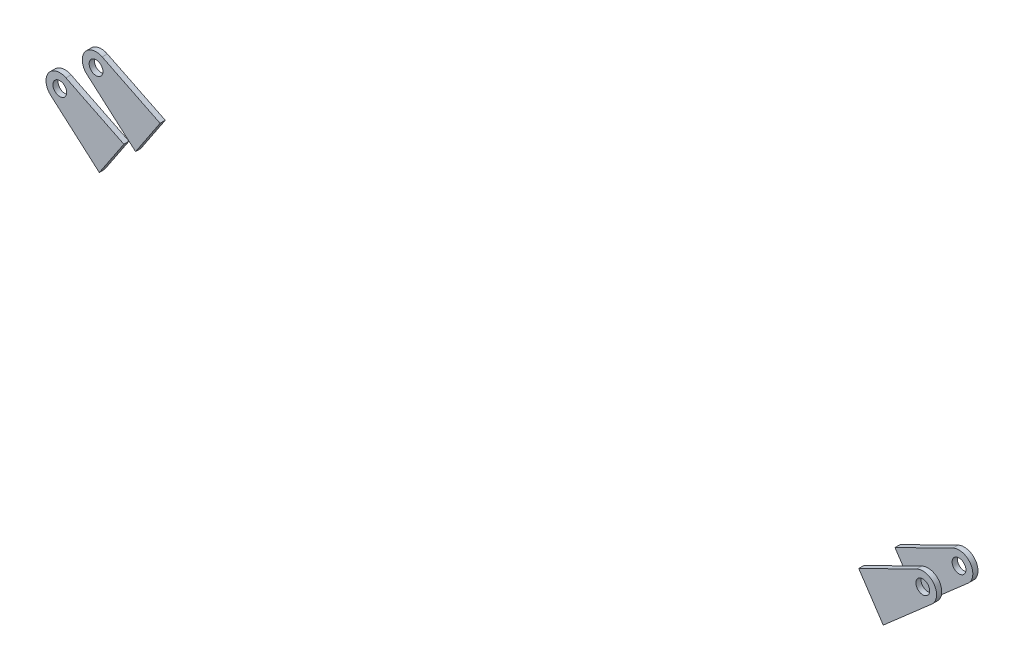
ISO-10303-21;
HEADER;
FILE_DESCRIPTION(('STEP AP214'),'2;1');
FILE_NAME('part.step','',(''),(''),'','','');
FILE_SCHEMA(('AUTOMOTIVE_DESIGN { 1 0 10303 214 1 1 1 1 }'));
ENDSEC;
DATA;
#1=APPLICATION_CONTEXT('core data for automotive mechanical design processes');
#2=APPLICATION_PROTOCOL_DEFINITION('international standard','automotive_design',2000,#1);
#3=PRODUCT_CONTEXT('',#1,'mechanical');
#4=PRODUCT('Part','Part','',(#3));
#5=PRODUCT_RELATED_PRODUCT_CATEGORY('part','',(#4));
#6=PRODUCT_DEFINITION_FORMATION('','',#4);
#7=PRODUCT_DEFINITION_CONTEXT('part definition',#1,'design');
#8=PRODUCT_DEFINITION('design','',#6,#7);
#9=PRODUCT_DEFINITION_SHAPE('','',#8);
#10=(LENGTH_UNIT() NAMED_UNIT(*) SI_UNIT(.MILLI.,.METRE.));
#11=(NAMED_UNIT(*) PLANE_ANGLE_UNIT() SI_UNIT($,.RADIAN.));
#12=(NAMED_UNIT(*) SI_UNIT($,.STERADIAN.) SOLID_ANGLE_UNIT());
#13=UNCERTAINTY_MEASURE_WITH_UNIT(LENGTH_MEASURE(1.E-05),#10,'distance_accuracy_value','');
#14=(GEOMETRIC_REPRESENTATION_CONTEXT(3) GLOBAL_UNCERTAINTY_ASSIGNED_CONTEXT((#13)) GLOBAL_UNIT_ASSIGNED_CONTEXT((#10,
#11,#12)) REPRESENTATION_CONTEXT('',''));
#15=CARTESIAN_POINT('',(0.,0.,0.));
#16=DIRECTION('',(0.,0.,1.));
#17=DIRECTION('',(1.,0.,0.));
#18=AXIS2_PLACEMENT_3D('',#15,#16,#17);
#19=CARTESIAN_POINT('',(2.08576992550041E-13,1.39051328366695E-13,120.));
#20=DIRECTION('',(0.,0.,1.));
#21=DIRECTION('',(1.,0.,0.));
#22=AXIS2_PLACEMENT_3D('',#19,#20,#21);
#23=PLANE('',#22);
#24=CARTESIAN_POINT('',(-250.,-2230.,119.999999999998));
#25=DIRECTION('',(0.,0.,-1.));
#26=DIRECTION('',(-1.,0.,0.));
#27=AXIS2_PLACEMENT_3D('',#24,#25,#26);
#28=CIRCLE('',#27,3.99999999999999);
#29=CARTESIAN_POINT('',(-254.,-2230.,119.999999999998));
#30=VERTEX_POINT('',#29);
#31=EDGE_CURVE('E145',#30,#30,#28,.T.);
#32=ORIENTED_EDGE('',*,*,#31,.F.);
#33=EDGE_LOOP('',(#32));
#34=FACE_BOUND('',#33,.T.);
#35=DIRECTION('',(0.55470019622526,0.832050294337823,0.));
#36=VECTOR('',#35,1.);
#37=CARTESIAN_POINT('',(-227.105319025276,-2260.65797853791,119.999999999998));
#38=LINE('',#37,#36);
#39=CARTESIAN_POINT('',(-227.105319025276,-2260.65797853791,119.999999999998));
#40=VERTEX_POINT('',#39);
#41=CARTESIAN_POINT('',(-212.894680974729,-2239.34202146209,119.999999999998));
#42=VERTEX_POINT('',#41);
#43=EDGE_CURVE('E131',#40,#42,#38,.T.);
#44=ORIENTED_EDGE('',*,*,#43,.F.);
#45=DIRECTION('',(0.752643086213187,-0.658428724142172,0.));
#46=VECTOR('',#45,1.);
#47=CARTESIAN_POINT('',(-255.267429793138,-2236.02114468971,119.999999999998));
#48=LINE('',#47,#46);
#49=CARTESIAN_POINT('',(-255.267429793138,-2236.02114468971,119.999999999998));
#50=VERTEX_POINT('',#49);
#51=EDGE_CURVE('E138',#50,#40,#48,.T.);
#52=ORIENTED_EDGE('',*,*,#51,.F.);
#53=CARTESIAN_POINT('',(-250.,-2230.,119.999999999998));
#54=DIRECTION('',(0.,0.,1.));
#55=DIRECTION('',(-1.,0.,0.));
#56=AXIS2_PLACEMENT_3D('',#53,#54,#55);
#57=CIRCLE('',#56,8.00000000000023);
#58=CARTESIAN_POINT('',(-246.467954822247,-2222.82193223337,119.999999999998));
#59=VERTEX_POINT('',#58);
#60=EDGE_CURVE('E160',#59,#50,#57,.T.);
#61=ORIENTED_EDGE('',*,*,#60,.F.);
#62=DIRECTION('',(-0.897258470828577,0.441505647219108,0.));
#63=VECTOR('',#62,1.);
#64=CARTESIAN_POINT('',(-212.894680974729,-2239.34202146209,119.999999999998));
#65=LINE('',#64,#63);
#66=EDGE_CURVE('E95',#42,#59,#65,.T.);
#67=ORIENTED_EDGE('',*,*,#66,.F.);
#68=EDGE_LOOP('',(#44,#52,#61,#67));
#69=FACE_BOUND('',#68,.T.);
#70=ADVANCED_FACE('F86',(#34,#69),#23,.F.);
#71=CARTESIAN_POINT('',(2.08576992550041E-13,1.39051328366695E-13,123.));
#72=DIRECTION('',(0.,0.,1.));
#73=DIRECTION('',(1.,0.,0.));
#74=AXIS2_PLACEMENT_3D('',#71,#72,#73);
#75=PLANE('',#74);
#76=CARTESIAN_POINT('',(-250.,-2230.,122.999999999998));
#77=DIRECTION('',(0.,0.,-1.));
#78=DIRECTION('',(-1.,0.,0.));
#79=AXIS2_PLACEMENT_3D('',#76,#77,#78);
#80=CIRCLE('',#79,3.99999999999999);
#81=CARTESIAN_POINT('',(-254.,-2230.,122.999999999998));
#82=VERTEX_POINT('',#81);
#83=EDGE_CURVE('E148',#82,#82,#80,.T.);
#84=ORIENTED_EDGE('',*,*,#83,.T.);
#85=EDGE_LOOP('',(#84));
#86=FACE_BOUND('',#85,.T.);
#87=DIRECTION('',(0.55470019622526,0.832050294337823,0.));
#88=VECTOR('',#87,1.);
#89=CARTESIAN_POINT('',(-227.105319025276,-2260.65797853791,122.999999999998));
#90=LINE('',#89,#88);
#91=CARTESIAN_POINT('',(-227.105319025276,-2260.65797853791,122.999999999998));
#92=VERTEX_POINT('',#91);
#93=CARTESIAN_POINT('',(-212.894680974729,-2239.34202146209,122.999999999998));
#94=VERTEX_POINT('',#93);
#95=EDGE_CURVE('E133',#92,#94,#90,.T.);
#96=ORIENTED_EDGE('',*,*,#95,.T.);
#97=DIRECTION('',(-0.897258470828577,0.441505647219108,0.));
#98=VECTOR('',#97,1.);
#99=CARTESIAN_POINT('',(-212.894680974729,-2239.34202146209,122.999999999998));
#100=LINE('',#99,#98);
#101=CARTESIAN_POINT('',(-246.467954822247,-2222.82193223337,122.999999999998));
#102=VERTEX_POINT('',#101);
#103=EDGE_CURVE('E13',#94,#102,#100,.T.);
#104=ORIENTED_EDGE('',*,*,#103,.T.);
#105=CARTESIAN_POINT('',(-250.,-2230.,122.999999999998));
#106=DIRECTION('',(0.,0.,1.));
#107=DIRECTION('',(-1.,0.,0.));
#108=AXIS2_PLACEMENT_3D('',#105,#106,#107);
#109=CIRCLE('',#108,8.00000000000023);
#110=CARTESIAN_POINT('',(-255.267429793138,-2236.02114468971,122.999999999998));
#111=VERTEX_POINT('',#110);
#112=EDGE_CURVE('E157',#102,#111,#109,.T.);
#113=ORIENTED_EDGE('',*,*,#112,.T.);
#114=DIRECTION('',(0.752643086213187,-0.658428724142172,0.));
#115=VECTOR('',#114,1.);
#116=CARTESIAN_POINT('',(-255.267429793138,-2236.02114468971,122.999999999998));
#117=LINE('',#116,#115);
#118=EDGE_CURVE('E162',#111,#92,#117,.T.);
#119=ORIENTED_EDGE('',*,*,#118,.T.);
#120=EDGE_LOOP('',(#96,#104,#113,#119));
#121=FACE_BOUND('',#120,.T.);
#122=ADVANCED_FACE('F174',(#86,#121),#75,.T.);
#123=CARTESIAN_POINT('',(-227.105319025276,-2260.65797853791,122.999999999998));
#124=DIRECTION('',(-0.832050294337823,0.55470019622526,0.));
#125=DIRECTION('',(0.55470019622526,0.832050294337824,0.));
#126=AXIS2_PLACEMENT_3D('',#123,#124,#125);
#127=PLANE('',#126);
#128=ORIENTED_EDGE('',*,*,#43,.T.);
#129=DIRECTION('',(0.,0.,-1.));
#130=VECTOR('',#129,1.);
#131=CARTESIAN_POINT('',(-212.894680974729,-2239.34202146209,122.999999999998));
#132=LINE('',#131,#130);
#133=EDGE_CURVE('E121',#94,#42,#132,.T.);
#134=ORIENTED_EDGE('',*,*,#133,.F.);
#135=ORIENTED_EDGE('',*,*,#95,.F.);
#136=DIRECTION('',(0.,0.,-1.));
#137=VECTOR('',#136,1.);
#138=CARTESIAN_POINT('',(-227.105319025276,-2260.65797853791,122.999999999998));
#139=LINE('',#138,#137);
#140=EDGE_CURVE('E127',#92,#40,#139,.T.);
#141=ORIENTED_EDGE('',*,*,#140,.T.);
#142=EDGE_LOOP('',(#128,#134,#135,#141));
#143=FACE_BOUND('',#142,.T.);
#144=ADVANCED_FACE('F129',(#143),#127,.F.);
#145=CARTESIAN_POINT('',(-255.267429793138,-2236.02114468971,122.999999999998));
#146=DIRECTION('',(0.658428724142172,0.752643086213187,0.));
#147=DIRECTION('',(0.752643086213187,-0.658428724142172,0.));
#148=AXIS2_PLACEMENT_3D('',#145,#146,#147);
#149=PLANE('',#148);
#150=ORIENTED_EDGE('',*,*,#51,.T.);
#151=ORIENTED_EDGE('',*,*,#140,.F.);
#152=ORIENTED_EDGE('',*,*,#118,.F.);
#153=DIRECTION('',(0.,0.,-1.));
#154=VECTOR('',#153,1.);
#155=CARTESIAN_POINT('',(-255.267429793138,-2236.02114468971,122.999999999998));
#156=LINE('',#155,#154);
#157=EDGE_CURVE('E140',#111,#50,#156,.T.);
#158=ORIENTED_EDGE('',*,*,#157,.T.);
#159=EDGE_LOOP('',(#150,#151,#152,#158));
#160=FACE_BOUND('',#159,.T.);
#161=ADVANCED_FACE('F139',(#160),#149,.F.);
#162=CARTESIAN_POINT('',(-250.,-2230.,122.999999999998));
#163=DIRECTION('',(0.,0.,-1.));
#164=DIRECTION('',(-1.,0.,0.));
#165=AXIS2_PLACEMENT_3D('',#162,#163,#164);
#166=CYLINDRICAL_SURFACE('',#165,8.00000000000023);
#167=ORIENTED_EDGE('',*,*,#60,.T.);
#168=ORIENTED_EDGE('',*,*,#157,.F.);
#169=ORIENTED_EDGE('',*,*,#112,.F.);
#170=DIRECTION('',(0.,0.,-1.));
#171=VECTOR('',#170,1.);
#172=CARTESIAN_POINT('',(-246.467954822247,-2222.82193223337,122.999999999998));
#173=LINE('',#172,#171);
#174=EDGE_CURVE('E104',#102,#59,#173,.T.);
#175=ORIENTED_EDGE('',*,*,#174,.T.);
#176=EDGE_LOOP('',(#167,#168,#169,#175));
#177=FACE_BOUND('',#176,.T.);
#178=ADVANCED_FACE('F210',(#177),#166,.T.);
#179=CARTESIAN_POINT('',(-212.894680974729,-2239.34202146209,122.999999999998));
#180=DIRECTION('',(-0.441505647219108,-0.897258470828577,0.));
#181=DIRECTION('',(-0.897258470828577,0.441505647219108,0.));
#182=AXIS2_PLACEMENT_3D('',#179,#180,#181);
#183=PLANE('',#182);
#184=ORIENTED_EDGE('',*,*,#66,.T.);
#185=ORIENTED_EDGE('',*,*,#174,.F.);
#186=ORIENTED_EDGE('',*,*,#103,.F.);
#187=ORIENTED_EDGE('',*,*,#133,.T.);
#188=EDGE_LOOP('',(#184,#185,#186,#187));
#189=FACE_BOUND('',#188,.T.);
#190=ADVANCED_FACE('F195',(#189),#183,.F.);
#191=CARTESIAN_POINT('',(-250.,-2230.,122.999999999998));
#192=DIRECTION('',(0.,0.,-1.));
#193=DIRECTION('',(-1.,0.,0.));
#194=AXIS2_PLACEMENT_3D('',#191,#192,#193);
#195=CYLINDRICAL_SURFACE('',#194,3.99999999999999);
#196=ORIENTED_EDGE('',*,*,#83,.F.);
#197=EDGE_LOOP('',(#196));
#198=FACE_BOUND('',#197,.T.);
#199=ORIENTED_EDGE('',*,*,#31,.T.);
#200=EDGE_LOOP('',(#199));
#201=FACE_BOUND('',#200,.T.);
#202=ADVANCED_FACE('F192',(#198,#201),#195,.F.);
#203=CLOSED_SHELL('',(#70,#122,#144,#161,#178,#190,#202));
#204=MANIFOLD_SOLID_BREP('B2',#203);
#205=CARTESIAN_POINT('',(2.08576992550041E-13,1.39051328366695E-13,143.999999999996));
#206=DIRECTION('',(0.,0.,-1.));
#207=DIRECTION('',(1.,0.,0.));
#208=AXIS2_PLACEMENT_3D('',#205,#206,#207);
#209=PLANE('',#208);
#210=CARTESIAN_POINT('',(-250.,-2230.,143.999999999998));
#211=DIRECTION('',(0.,0.,-1.));
#212=DIRECTION('',(-1.,0.,0.));
#213=AXIS2_PLACEMENT_3D('',#210,#211,#212);
#214=CIRCLE('',#213,3.99999999999999);
#215=CARTESIAN_POINT('',(-254.,-2230.,143.999999999998));
#216=VERTEX_POINT('',#215);
#217=EDGE_CURVE('E325',#216,#216,#214,.T.);
#218=ORIENTED_EDGE('',*,*,#217,.T.);
#219=EDGE_LOOP('',(#218));
#220=FACE_BOUND('',#219,.T.);
#221=DIRECTION('',(0.55470019622526,0.832050294337823,0.));
#222=VECTOR('',#221,1.);
#223=CARTESIAN_POINT('',(-227.105319025276,-2260.65797853791,143.999999999998));
#224=LINE('',#223,#222);
#225=CARTESIAN_POINT('',(-227.105319025276,-2260.65797853791,143.999999999998));
#226=VERTEX_POINT('',#225);
#227=CARTESIAN_POINT('',(-212.894680974729,-2239.34202146209,143.999999999998));
#228=VERTEX_POINT('',#227);
#229=EDGE_CURVE('E317',#226,#228,#224,.T.);
#230=ORIENTED_EDGE('',*,*,#229,.T.);
#231=DIRECTION('',(-0.897258470828577,0.441505647219108,0.));
#232=VECTOR('',#231,1.);
#233=CARTESIAN_POINT('',(-212.894680974729,-2239.34202146209,143.999999999998));
#234=LINE('',#233,#232);
#235=CARTESIAN_POINT('',(-246.467954822247,-2222.82193223337,143.999999999998));
#236=VERTEX_POINT('',#235);
#237=EDGE_CURVE('E274',#228,#236,#234,.T.);
#238=ORIENTED_EDGE('',*,*,#237,.T.);
#239=CARTESIAN_POINT('',(-250.,-2230.,143.999999999998));
#240=DIRECTION('',(0.,0.,1.));
#241=DIRECTION('',(-1.,0.,0.));
#242=AXIS2_PLACEMENT_3D('',#239,#240,#241);
#243=CIRCLE('',#242,8.00000000000023);
#244=CARTESIAN_POINT('',(-255.267429793138,-2236.02114468971,143.999999999998));
#245=VERTEX_POINT('',#244);
#246=EDGE_CURVE('E321',#236,#245,#243,.T.);
#247=ORIENTED_EDGE('',*,*,#246,.T.);
#248=DIRECTION('',(0.752643086213187,-0.658428724142172,0.));
#249=VECTOR('',#248,1.);
#250=CARTESIAN_POINT('',(-255.267429793138,-2236.02114468971,143.999999999998));
#251=LINE('',#250,#249);
#252=EDGE_CURVE('E311',#245,#226,#251,.T.);
#253=ORIENTED_EDGE('',*,*,#252,.T.);
#254=EDGE_LOOP('',(#230,#238,#247,#253));
#255=FACE_BOUND('',#254,.T.);
#256=ADVANCED_FACE('F265',(#220,#255),#209,.F.);
#257=CARTESIAN_POINT('',(2.08576992550041E-13,1.39051328366695E-13,140.999999999996));
#258=DIRECTION('',(0.,0.,-1.));
#259=DIRECTION('',(1.,0.,0.));
#260=AXIS2_PLACEMENT_3D('',#257,#258,#259);
#261=PLANE('',#260);
#262=CARTESIAN_POINT('',(-250.,-2230.,140.999999999998));
#263=DIRECTION('',(0.,0.,-1.));
#264=DIRECTION('',(-1.,0.,0.));
#265=AXIS2_PLACEMENT_3D('',#262,#263,#264);
#266=CIRCLE('',#265,3.99999999999999);
#267=CARTESIAN_POINT('',(-254.,-2230.,140.999999999998));
#268=VERTEX_POINT('',#267);
#269=EDGE_CURVE('E328',#268,#268,#266,.T.);
#270=ORIENTED_EDGE('',*,*,#269,.F.);
#271=EDGE_LOOP('',(#270));
#272=FACE_BOUND('',#271,.T.);
#273=DIRECTION('',(0.55470019622526,0.832050294337823,0.));
#274=VECTOR('',#273,1.);
#275=CARTESIAN_POINT('',(-227.105319025276,-2260.65797853791,140.999999999998));
#276=LINE('',#275,#274);
#277=CARTESIAN_POINT('',(-227.105319025276,-2260.65797853791,140.999999999998));
#278=VERTEX_POINT('',#277);
#279=CARTESIAN_POINT('',(-212.894680974729,-2239.34202146209,140.999999999998));
#280=VERTEX_POINT('',#279);
#281=EDGE_CURVE('E316',#278,#280,#276,.T.);
#282=ORIENTED_EDGE('',*,*,#281,.F.);
#283=DIRECTION('',(0.752643086213187,-0.658428724142172,0.));
#284=VECTOR('',#283,1.);
#285=CARTESIAN_POINT('',(-255.267429793138,-2236.02114468971,140.999999999998));
#286=LINE('',#285,#284);
#287=CARTESIAN_POINT('',(-255.267429793138,-2236.02114468971,140.999999999998));
#288=VERTEX_POINT('',#287);
#289=EDGE_CURVE('E314',#288,#278,#286,.T.);
#290=ORIENTED_EDGE('',*,*,#289,.F.);
#291=CARTESIAN_POINT('',(-250.,-2230.,140.999999999998));
#292=DIRECTION('',(0.,0.,1.));
#293=DIRECTION('',(-1.,0.,0.));
#294=AXIS2_PLACEMENT_3D('',#291,#292,#293);
#295=CIRCLE('',#294,8.00000000000023);
#296=CARTESIAN_POINT('',(-246.467954822247,-2222.82193223337,140.999999999998));
#297=VERTEX_POINT('',#296);
#298=EDGE_CURVE('E337',#297,#288,#295,.T.);
#299=ORIENTED_EDGE('',*,*,#298,.F.);
#300=DIRECTION('',(-0.897258470828577,0.441505647219108,0.));
#301=VECTOR('',#300,1.);
#302=CARTESIAN_POINT('',(-212.894680974729,-2239.34202146209,140.999999999998));
#303=LINE('',#302,#301);
#304=EDGE_CURVE('E84',#280,#297,#303,.T.);
#305=ORIENTED_EDGE('',*,*,#304,.F.);
#306=EDGE_LOOP('',(#282,#290,#299,#305));
#307=FACE_BOUND('',#306,.T.);
#308=ADVANCED_FACE('F354',(#272,#307),#261,.T.);
#309=CARTESIAN_POINT('',(-227.105319025276,-2260.65797853791,140.999999999998));
#310=DIRECTION('',(-0.832050294337823,0.55470019622526,0.));
#311=DIRECTION('',(0.55470019622526,0.832050294337824,0.));
#312=AXIS2_PLACEMENT_3D('',#309,#310,#311);
#313=PLANE('',#312);
#314=ORIENTED_EDGE('',*,*,#229,.F.);
#315=DIRECTION('',(0.,0.,1.));
#316=VECTOR('',#315,1.);
#317=CARTESIAN_POINT('',(-227.105319025276,-2260.65797853791,140.999999999998));
#318=LINE('',#317,#316);
#319=EDGE_CURVE('E308',#278,#226,#318,.T.);
#320=ORIENTED_EDGE('',*,*,#319,.F.);
#321=ORIENTED_EDGE('',*,*,#281,.T.);
#322=DIRECTION('',(0.,0.,1.));
#323=VECTOR('',#322,1.);
#324=CARTESIAN_POINT('',(-212.894680974729,-2239.34202146209,140.999999999998));
#325=LINE('',#324,#323);
#326=EDGE_CURVE('E302',#280,#228,#325,.T.);
#327=ORIENTED_EDGE('',*,*,#326,.T.);
#328=EDGE_LOOP('',(#314,#320,#321,#327));
#329=FACE_BOUND('',#328,.T.);
#330=ADVANCED_FACE('F324',(#329),#313,.F.);
#331=CARTESIAN_POINT('',(-255.267429793138,-2236.02114468971,140.999999999998));
#332=DIRECTION('',(0.658428724142172,0.752643086213187,0.));
#333=DIRECTION('',(0.752643086213187,-0.658428724142172,0.));
#334=AXIS2_PLACEMENT_3D('',#331,#332,#333);
#335=PLANE('',#334);
#336=ORIENTED_EDGE('',*,*,#252,.F.);
#337=DIRECTION('',(0.,0.,1.));
#338=VECTOR('',#337,1.);
#339=CARTESIAN_POINT('',(-255.267429793138,-2236.02114468971,140.999999999998));
#340=LINE('',#339,#338);
#341=EDGE_CURVE('E322',#288,#245,#340,.T.);
#342=ORIENTED_EDGE('',*,*,#341,.F.);
#343=ORIENTED_EDGE('',*,*,#289,.T.);
#344=ORIENTED_EDGE('',*,*,#319,.T.);
#345=EDGE_LOOP('',(#336,#342,#343,#344));
#346=FACE_BOUND('',#345,.T.);
#347=ADVANCED_FACE('F310',(#346),#335,.F.);
#348=CARTESIAN_POINT('',(-250.,-2230.,140.999999999998));
#349=DIRECTION('',(0.,0.,1.));
#350=DIRECTION('',(-1.,0.,0.));
#351=AXIS2_PLACEMENT_3D('',#348,#349,#350);
#352=CYLINDRICAL_SURFACE('',#351,8.00000000000023);
#353=ORIENTED_EDGE('',*,*,#246,.F.);
#354=DIRECTION('',(0.,0.,1.));
#355=VECTOR('',#354,1.);
#356=CARTESIAN_POINT('',(-246.467954822247,-2222.82193223337,140.999999999998));
#357=LINE('',#356,#355);
#358=EDGE_CURVE('E283',#297,#236,#357,.T.);
#359=ORIENTED_EDGE('',*,*,#358,.F.);
#360=ORIENTED_EDGE('',*,*,#298,.T.);
#361=ORIENTED_EDGE('',*,*,#341,.T.);
#362=EDGE_LOOP('',(#353,#359,#360,#361));
#363=FACE_BOUND('',#362,.T.);
#364=ADVANCED_FACE('F350',(#363),#352,.T.);
#365=CARTESIAN_POINT('',(-212.894680974729,-2239.34202146209,140.999999999998));
#366=DIRECTION('',(-0.441505647219108,-0.897258470828577,0.));
#367=DIRECTION('',(-0.897258470828577,0.441505647219108,0.));
#368=AXIS2_PLACEMENT_3D('',#365,#366,#367);
#369=PLANE('',#368);
#370=ORIENTED_EDGE('',*,*,#237,.F.);
#371=ORIENTED_EDGE('',*,*,#326,.F.);
#372=ORIENTED_EDGE('',*,*,#304,.T.);
#373=ORIENTED_EDGE('',*,*,#358,.T.);
#374=EDGE_LOOP('',(#370,#371,#372,#373));
#375=FACE_BOUND('',#374,.T.);
#376=ADVANCED_FACE('F367',(#375),#369,.F.);
#377=CARTESIAN_POINT('',(-250.,-2230.,140.999999999998));
#378=DIRECTION('',(0.,0.,1.));
#379=DIRECTION('',(-1.,0.,0.));
#380=AXIS2_PLACEMENT_3D('',#377,#378,#379);
#381=CYLINDRICAL_SURFACE('',#380,3.99999999999999);
#382=ORIENTED_EDGE('',*,*,#269,.T.);
#383=EDGE_LOOP('',(#382));
#384=FACE_BOUND('',#383,.T.);
#385=ORIENTED_EDGE('',*,*,#217,.F.);
#386=EDGE_LOOP('',(#385));
#387=FACE_BOUND('',#386,.T.);
#388=ADVANCED_FACE('F369',(#384,#387),#381,.F.);
#389=CLOSED_SHELL('',(#256,#308,#330,#347,#364,#376,#388));
#390=MANIFOLD_SOLID_BREP('B7',#389);
#391=CARTESIAN_POINT('',(-2.08576992550041E-13,1.39051328366695E-13,120.));
#392=DIRECTION('',(0.,0.,1.));
#393=DIRECTION('',(-1.,0.,0.));
#394=AXIS2_PLACEMENT_3D('',#391,#392,#393);
#395=PLANE('',#394);
#396=CARTESIAN_POINT('',(250.,-2230.,119.999999999998));
#397=DIRECTION('',(0.,0.,1.));
#398=DIRECTION('',(1.,0.,0.));
#399=AXIS2_PLACEMENT_3D('',#396,#397,#398);
#400=CIRCLE('',#399,3.99999999999999);
#401=CARTESIAN_POINT('',(254.,-2230.,119.999999999998));
#402=VERTEX_POINT('',#401);
#403=EDGE_CURVE('E503',#402,#402,#400,.T.);
#404=ORIENTED_EDGE('',*,*,#403,.T.);
#405=EDGE_LOOP('',(#404));
#406=FACE_BOUND('',#405,.T.);
#407=DIRECTION('',(-0.55470019622526,0.832050294337823,0.));
#408=VECTOR('',#407,1.);
#409=CARTESIAN_POINT('',(227.105319025276,-2260.65797853791,119.999999999998));
#410=LINE('',#409,#408);
#411=CARTESIAN_POINT('',(227.105319025276,-2260.65797853791,119.999999999998));
#412=VERTEX_POINT('',#411);
#413=CARTESIAN_POINT('',(212.894680974729,-2239.34202146209,119.999999999998));
#414=VERTEX_POINT('',#413);
#415=EDGE_CURVE('E495',#412,#414,#410,.T.);
#416=ORIENTED_EDGE('',*,*,#415,.T.);
#417=DIRECTION('',(0.897258470828577,0.441505647219108,0.));
#418=VECTOR('',#417,1.);
#419=CARTESIAN_POINT('',(212.894680974729,-2239.34202146209,119.999999999998));
#420=LINE('',#419,#418);
#421=CARTESIAN_POINT('',(246.467954822247,-2222.82193223337,119.999999999998));
#422=VERTEX_POINT('',#421);
#423=EDGE_CURVE('E452',#414,#422,#420,.T.);
#424=ORIENTED_EDGE('',*,*,#423,.T.);
#425=CARTESIAN_POINT('',(250.,-2230.,119.999999999998));
#426=DIRECTION('',(0.,0.,-1.));
#427=DIRECTION('',(1.,0.,0.));
#428=AXIS2_PLACEMENT_3D('',#425,#426,#427);
#429=CIRCLE('',#428,8.00000000000023);
#430=CARTESIAN_POINT('',(255.267429793138,-2236.02114468971,119.999999999998));
#431=VERTEX_POINT('',#430);
#432=EDGE_CURVE('E499',#422,#431,#429,.T.);
#433=ORIENTED_EDGE('',*,*,#432,.T.);
#434=DIRECTION('',(-0.752643086213187,-0.658428724142172,0.));
#435=VECTOR('',#434,1.);
#436=CARTESIAN_POINT('',(255.267429793138,-2236.02114468971,119.999999999998));
#437=LINE('',#436,#435);
#438=EDGE_CURVE('E489',#431,#412,#437,.T.);
#439=ORIENTED_EDGE('',*,*,#438,.T.);
#440=EDGE_LOOP('',(#416,#424,#433,#439));
#441=FACE_BOUND('',#440,.T.);
#442=ADVANCED_FACE('F443',(#406,#441),#395,.F.);
#443=CARTESIAN_POINT('',(-2.08576992550041E-13,1.39051328366695E-13,123.));
#444=DIRECTION('',(0.,0.,1.));
#445=DIRECTION('',(-1.,0.,0.));
#446=AXIS2_PLACEMENT_3D('',#443,#444,#445);
#447=PLANE('',#446);
#448=CARTESIAN_POINT('',(250.,-2230.,122.999999999998));
#449=DIRECTION('',(0.,0.,1.));
#450=DIRECTION('',(1.,0.,0.));
#451=AXIS2_PLACEMENT_3D('',#448,#449,#450);
#452=CIRCLE('',#451,3.99999999999999);
#453=CARTESIAN_POINT('',(254.,-2230.,122.999999999998));
#454=VERTEX_POINT('',#453);
#455=EDGE_CURVE('E506',#454,#454,#452,.T.);
#456=ORIENTED_EDGE('',*,*,#455,.F.);
#457=EDGE_LOOP('',(#456));
#458=FACE_BOUND('',#457,.T.);
#459=DIRECTION('',(-0.55470019622526,0.832050294337823,0.));
#460=VECTOR('',#459,1.);
#461=CARTESIAN_POINT('',(227.105319025276,-2260.65797853791,122.999999999998));
#462=LINE('',#461,#460);
#463=CARTESIAN_POINT('',(227.105319025276,-2260.65797853791,122.999999999998));
#464=VERTEX_POINT('',#463);
#465=CARTESIAN_POINT('',(212.894680974729,-2239.34202146209,122.999999999998));
#466=VERTEX_POINT('',#465);
#467=EDGE_CURVE('E494',#464,#466,#462,.T.);
#468=ORIENTED_EDGE('',*,*,#467,.F.);
#469=DIRECTION('',(-0.752643086213187,-0.658428724142172,0.));
#470=VECTOR('',#469,1.);
#471=CARTESIAN_POINT('',(255.267429793138,-2236.02114468971,122.999999999998));
#472=LINE('',#471,#470);
#473=CARTESIAN_POINT('',(255.267429793138,-2236.02114468971,122.999999999998));
#474=VERTEX_POINT('',#473);
#475=EDGE_CURVE('E492',#474,#464,#472,.T.);
#476=ORIENTED_EDGE('',*,*,#475,.F.);
#477=CARTESIAN_POINT('',(250.,-2230.,122.999999999998));
#478=DIRECTION('',(0.,0.,-1.));
#479=DIRECTION('',(1.,0.,0.));
#480=AXIS2_PLACEMENT_3D('',#477,#478,#479);
#481=CIRCLE('',#480,8.00000000000023);
#482=CARTESIAN_POINT('',(246.467954822247,-2222.82193223337,122.999999999998));
#483=VERTEX_POINT('',#482);
#484=EDGE_CURVE('E515',#483,#474,#481,.T.);
#485=ORIENTED_EDGE('',*,*,#484,.F.);
#486=DIRECTION('',(0.897258470828577,0.441505647219108,0.));
#487=VECTOR('',#486,1.);
#488=CARTESIAN_POINT('',(212.894680974729,-2239.34202146209,122.999999999998));
#489=LINE('',#488,#487);
#490=EDGE_CURVE('E263',#466,#483,#489,.T.);
#491=ORIENTED_EDGE('',*,*,#490,.F.);
#492=EDGE_LOOP('',(#468,#476,#485,#491));
#493=FACE_BOUND('',#492,.T.);
#494=ADVANCED_FACE('F532',(#458,#493),#447,.T.);
#495=CARTESIAN_POINT('',(227.105319025276,-2260.65797853791,122.999999999998));
#496=DIRECTION('',(0.832050294337823,0.55470019622526,0.));
#497=DIRECTION('',(-0.55470019622526,0.832050294337824,0.));
#498=AXIS2_PLACEMENT_3D('',#495,#496,#497);
#499=PLANE('',#498);
#500=ORIENTED_EDGE('',*,*,#415,.F.);
#501=DIRECTION('',(0.,0.,-1.));
#502=VECTOR('',#501,1.);
#503=CARTESIAN_POINT('',(227.105319025276,-2260.65797853791,122.999999999998));
#504=LINE('',#503,#502);
#505=EDGE_CURVE('E486',#464,#412,#504,.T.);
#506=ORIENTED_EDGE('',*,*,#505,.F.);
#507=ORIENTED_EDGE('',*,*,#467,.T.);
#508=DIRECTION('',(0.,0.,-1.));
#509=VECTOR('',#508,1.);
#510=CARTESIAN_POINT('',(212.894680974729,-2239.34202146209,122.999999999998));
#511=LINE('',#510,#509);
#512=EDGE_CURVE('E480',#466,#414,#511,.T.);
#513=ORIENTED_EDGE('',*,*,#512,.T.);
#514=EDGE_LOOP('',(#500,#506,#507,#513));
#515=FACE_BOUND('',#514,.T.);
#516=ADVANCED_FACE('F502',(#515),#499,.F.);
#517=CARTESIAN_POINT('',(255.267429793138,-2236.02114468971,122.999999999998));
#518=DIRECTION('',(-0.658428724142172,0.752643086213187,0.));
#519=DIRECTION('',(-0.752643086213187,-0.658428724142172,0.));
#520=AXIS2_PLACEMENT_3D('',#517,#518,#519);
#521=PLANE('',#520);
#522=ORIENTED_EDGE('',*,*,#438,.F.);
#523=DIRECTION('',(0.,0.,-1.));
#524=VECTOR('',#523,1.);
#525=CARTESIAN_POINT('',(255.267429793138,-2236.02114468971,122.999999999998));
#526=LINE('',#525,#524);
#527=EDGE_CURVE('E500',#474,#431,#526,.T.);
#528=ORIENTED_EDGE('',*,*,#527,.F.);
#529=ORIENTED_EDGE('',*,*,#475,.T.);
#530=ORIENTED_EDGE('',*,*,#505,.T.);
#531=EDGE_LOOP('',(#522,#528,#529,#530));
#532=FACE_BOUND('',#531,.T.);
#533=ADVANCED_FACE('F488',(#532),#521,.F.);
#534=CARTESIAN_POINT('',(250.,-2230.,122.999999999998));
#535=DIRECTION('',(0.,0.,-1.));
#536=DIRECTION('',(1.,0.,0.));
#537=AXIS2_PLACEMENT_3D('',#534,#535,#536);
#538=CYLINDRICAL_SURFACE('',#537,8.00000000000023);
#539=ORIENTED_EDGE('',*,*,#432,.F.);
#540=DIRECTION('',(0.,0.,-1.));
#541=VECTOR('',#540,1.);
#542=CARTESIAN_POINT('',(246.467954822247,-2222.82193223337,122.999999999998));
#543=LINE('',#542,#541);
#544=EDGE_CURVE('E461',#483,#422,#543,.T.);
#545=ORIENTED_EDGE('',*,*,#544,.F.);
#546=ORIENTED_EDGE('',*,*,#484,.T.);
#547=ORIENTED_EDGE('',*,*,#527,.T.);
#548=EDGE_LOOP('',(#539,#545,#546,#547));
#549=FACE_BOUND('',#548,.T.);
#550=ADVANCED_FACE('F528',(#549),#538,.T.);
#551=CARTESIAN_POINT('',(212.894680974729,-2239.34202146209,122.999999999998));
#552=DIRECTION('',(0.441505647219108,-0.897258470828577,0.));
#553=DIRECTION('',(0.897258470828577,0.441505647219108,0.));
#554=AXIS2_PLACEMENT_3D('',#551,#552,#553);
#555=PLANE('',#554);
#556=ORIENTED_EDGE('',*,*,#423,.F.);
#557=ORIENTED_EDGE('',*,*,#512,.F.);
#558=ORIENTED_EDGE('',*,*,#490,.T.);
#559=ORIENTED_EDGE('',*,*,#544,.T.);
#560=EDGE_LOOP('',(#556,#557,#558,#559));
#561=FACE_BOUND('',#560,.T.);
#562=ADVANCED_FACE('F545',(#561),#555,.F.);
#563=CARTESIAN_POINT('',(250.,-2230.,122.999999999998));
#564=DIRECTION('',(0.,0.,-1.));
#565=DIRECTION('',(1.,0.,0.));
#566=AXIS2_PLACEMENT_3D('',#563,#564,#565);
#567=CYLINDRICAL_SURFACE('',#566,3.99999999999999);
#568=ORIENTED_EDGE('',*,*,#455,.T.);
#569=EDGE_LOOP('',(#568));
#570=FACE_BOUND('',#569,.T.);
#571=ORIENTED_EDGE('',*,*,#403,.F.);
#572=EDGE_LOOP('',(#571));
#573=FACE_BOUND('',#572,.T.);
#574=ADVANCED_FACE('F547',(#570,#573),#567,.F.);
#575=CLOSED_SHELL('',(#442,#494,#516,#533,#550,#562,#574));
#576=MANIFOLD_SOLID_BREP('B78',#575);
#577=CARTESIAN_POINT('',(-2.08576992550041E-13,1.39051328366695E-13,143.999999999996));
#578=DIRECTION('',(0.,0.,-1.));
#579=DIRECTION('',(-1.,0.,0.));
#580=AXIS2_PLACEMENT_3D('',#577,#578,#579);
#581=PLANE('',#580);
#582=CARTESIAN_POINT('',(250.,-2230.,143.999999999998));
#583=DIRECTION('',(0.,0.,1.));
#584=DIRECTION('',(1.,0.,0.));
#585=AXIS2_PLACEMENT_3D('',#582,#583,#584);
#586=CIRCLE('',#585,3.99999999999999);
#587=CARTESIAN_POINT('',(254.,-2230.,143.999999999998));
#588=VERTEX_POINT('',#587);
#589=EDGE_CURVE('E672',#588,#588,#586,.T.);
#590=ORIENTED_EDGE('',*,*,#589,.F.);
#591=EDGE_LOOP('',(#590));
#592=FACE_BOUND('',#591,.T.);
#593=DIRECTION('',(-0.55470019622526,0.832050294337823,0.));
#594=VECTOR('',#593,1.);
#595=CARTESIAN_POINT('',(227.105319025276,-2260.65797853791,143.999999999998));
#596=LINE('',#595,#594);
#597=CARTESIAN_POINT('',(227.105319025276,-2260.65797853791,143.999999999998));
#598=VERTEX_POINT('',#597);
#599=CARTESIAN_POINT('',(212.894680974729,-2239.34202146209,143.999999999998));
#600=VERTEX_POINT('',#599);
#601=EDGE_CURVE('E652',#598,#600,#596,.T.);
#602=ORIENTED_EDGE('',*,*,#601,.F.);
#603=DIRECTION('',(-0.752643086213187,-0.658428724142172,0.));
#604=VECTOR('',#603,1.);
#605=CARTESIAN_POINT('',(255.267429793138,-2236.02114468971,143.999999999998));
#606=LINE('',#605,#604);
#607=CARTESIAN_POINT('',(255.267429793138,-2236.02114468971,143.999999999998));
#608=VERTEX_POINT('',#607);
#609=EDGE_CURVE('E659',#608,#598,#606,.T.);
#610=ORIENTED_EDGE('',*,*,#609,.F.);
#611=CARTESIAN_POINT('',(250.,-2230.,143.999999999998));
#612=DIRECTION('',(0.,0.,-1.));
#613=DIRECTION('',(1.,0.,0.));
#614=AXIS2_PLACEMENT_3D('',#611,#612,#613);
#615=CIRCLE('',#614,8.00000000000023);
#616=CARTESIAN_POINT('',(246.467954822247,-2222.82193223337,143.999999999998));
#617=VERTEX_POINT('',#616);
#618=EDGE_CURVE('E686',#617,#608,#615,.T.);
#619=ORIENTED_EDGE('',*,*,#618,.F.);
#620=DIRECTION('',(0.897258470828577,0.441505647219108,0.));
#621=VECTOR('',#620,1.);
#622=CARTESIAN_POINT('',(212.894680974729,-2239.34202146209,143.999999999998));
#623=LINE('',#622,#621);
#624=EDGE_CURVE('E621',#600,#617,#623,.T.);
#625=ORIENTED_EDGE('',*,*,#624,.F.);
#626=EDGE_LOOP('',(#602,#610,#619,#625));
#627=FACE_BOUND('',#626,.T.);
#628=ADVANCED_FACE('F612',(#592,#627),#581,.F.);
#629=CARTESIAN_POINT('',(-2.08576992550041E-13,1.39051328366695E-13,140.999999999996));
#630=DIRECTION('',(0.,0.,-1.));
#631=DIRECTION('',(-1.,0.,0.));
#632=AXIS2_PLACEMENT_3D('',#629,#630,#631);
#633=PLANE('',#632);
#634=CARTESIAN_POINT('',(250.,-2230.,140.999999999998));
#635=DIRECTION('',(0.,0.,1.));
#636=DIRECTION('',(1.,0.,0.));
#637=AXIS2_PLACEMENT_3D('',#634,#635,#636);
#638=CIRCLE('',#637,3.99999999999999);
#639=CARTESIAN_POINT('',(254.,-2230.,140.999999999998));
#640=VERTEX_POINT('',#639);
#641=EDGE_CURVE('E675',#640,#640,#638,.T.);
#642=ORIENTED_EDGE('',*,*,#641,.T.);
#643=EDGE_LOOP('',(#642));
#644=FACE_BOUND('',#643,.T.);
#645=DIRECTION('',(-0.55470019622526,0.832050294337823,0.));
#646=VECTOR('',#645,1.);
#647=CARTESIAN_POINT('',(227.105319025276,-2260.65797853791,140.999999999998));
#648=LINE('',#647,#646);
#649=CARTESIAN_POINT('',(227.105319025276,-2260.65797853791,140.999999999998));
#650=VERTEX_POINT('',#649);
#651=CARTESIAN_POINT('',(212.894680974729,-2239.34202146209,140.999999999998));
#652=VERTEX_POINT('',#651);
#653=EDGE_CURVE('E670',#650,#652,#648,.T.);
#654=ORIENTED_EDGE('',*,*,#653,.T.);
#655=DIRECTION('',(0.897258470828577,0.441505647219108,0.));
#656=VECTOR('',#655,1.);
#657=CARTESIAN_POINT('',(212.894680974729,-2239.34202146209,140.999999999998));
#658=LINE('',#657,#656);
#659=CARTESIAN_POINT('',(246.467954822247,-2222.82193223337,140.999999999998));
#660=VERTEX_POINT('',#659);
#661=EDGE_CURVE('E441',#652,#660,#658,.T.);
#662=ORIENTED_EDGE('',*,*,#661,.T.);
#663=CARTESIAN_POINT('',(250.,-2230.,140.999999999998));
#664=DIRECTION('',(0.,0.,-1.));
#665=DIRECTION('',(1.,0.,0.));
#666=AXIS2_PLACEMENT_3D('',#663,#664,#665);
#667=CIRCLE('',#666,8.00000000000023);
#668=CARTESIAN_POINT('',(255.267429793138,-2236.02114468971,140.999999999998));
#669=VERTEX_POINT('',#668);
#670=EDGE_CURVE('E630',#660,#669,#667,.T.);
#671=ORIENTED_EDGE('',*,*,#670,.T.);
#672=DIRECTION('',(-0.752643086213187,-0.658428724142172,0.));
#673=VECTOR('',#672,1.);
#674=CARTESIAN_POINT('',(255.267429793138,-2236.02114468971,140.999999999998));
#675=LINE('',#674,#673);
#676=EDGE_CURVE('E689',#669,#650,#675,.T.);
#677=ORIENTED_EDGE('',*,*,#676,.T.);
#678=EDGE_LOOP('',(#654,#662,#671,#677));
#679=FACE_BOUND('',#678,.T.);
#680=ADVANCED_FACE('F700',(#644,#679),#633,.T.);
#681=CARTESIAN_POINT('',(227.105319025276,-2260.65797853791,140.999999999998));
#682=DIRECTION('',(0.832050294337823,0.55470019622526,0.));
#683=DIRECTION('',(-0.55470019622526,0.832050294337824,0.));
#684=AXIS2_PLACEMENT_3D('',#681,#682,#683);
#685=PLANE('',#684);
#686=ORIENTED_EDGE('',*,*,#601,.T.);
#687=DIRECTION('',(0.,0.,1.));
#688=VECTOR('',#687,1.);
#689=CARTESIAN_POINT('',(212.894680974729,-2239.34202146209,140.999999999998));
#690=LINE('',#689,#688);
#691=EDGE_CURVE('E666',#652,#600,#690,.T.);
#692=ORIENTED_EDGE('',*,*,#691,.F.);
#693=ORIENTED_EDGE('',*,*,#653,.F.);
#694=DIRECTION('',(0.,0.,1.));
#695=VECTOR('',#694,1.);
#696=CARTESIAN_POINT('',(227.105319025276,-2260.65797853791,140.999999999998));
#697=LINE('',#696,#695);
#698=EDGE_CURVE('E661',#650,#598,#697,.T.);
#699=ORIENTED_EDGE('',*,*,#698,.T.);
#700=EDGE_LOOP('',(#686,#692,#693,#699));
#701=FACE_BOUND('',#700,.T.);
#702=ADVANCED_FACE('F668',(#701),#685,.F.);
#703=CARTESIAN_POINT('',(255.267429793138,-2236.02114468971,140.999999999998));
#704=DIRECTION('',(-0.658428724142172,0.752643086213187,0.));
#705=DIRECTION('',(-0.752643086213187,-0.658428724142172,0.));
#706=AXIS2_PLACEMENT_3D('',#703,#704,#705);
#707=PLANE('',#706);
#708=ORIENTED_EDGE('',*,*,#609,.T.);
#709=ORIENTED_EDGE('',*,*,#698,.F.);
#710=ORIENTED_EDGE('',*,*,#676,.F.);
#711=DIRECTION('',(0.,0.,1.));
#712=VECTOR('',#711,1.);
#713=CARTESIAN_POINT('',(255.267429793138,-2236.02114468971,140.999999999998));
#714=LINE('',#713,#712);
#715=EDGE_CURVE('E663',#669,#608,#714,.T.);
#716=ORIENTED_EDGE('',*,*,#715,.T.);
#717=EDGE_LOOP('',(#708,#709,#710,#716));
#718=FACE_BOUND('',#717,.T.);
#719=ADVANCED_FACE('F660',(#718),#707,.F.);
#720=CARTESIAN_POINT('',(250.,-2230.,140.999999999998));
#721=DIRECTION('',(0.,0.,1.));
#722=DIRECTION('',(1.,0.,0.));
#723=AXIS2_PLACEMENT_3D('',#720,#721,#722);
#724=CYLINDRICAL_SURFACE('',#723,8.00000000000023);
#725=ORIENTED_EDGE('',*,*,#618,.T.);
#726=ORIENTED_EDGE('',*,*,#715,.F.);
#727=ORIENTED_EDGE('',*,*,#670,.F.);
#728=DIRECTION('',(0.,0.,1.));
#729=VECTOR('',#728,1.);
#730=CARTESIAN_POINT('',(246.467954822247,-2222.82193223337,140.999999999998));
#731=LINE('',#730,#729);
#732=EDGE_CURVE('E688',#660,#617,#731,.T.);
#733=ORIENTED_EDGE('',*,*,#732,.T.);
#734=EDGE_LOOP('',(#725,#726,#727,#733));
#735=FACE_BOUND('',#734,.T.);
#736=ADVANCED_FACE('F701',(#735),#724,.T.);
#737=CARTESIAN_POINT('',(212.894680974729,-2239.34202146209,140.999999999998));
#738=DIRECTION('',(0.441505647219108,-0.897258470828577,0.));
#739=DIRECTION('',(0.897258470828577,0.441505647219108,0.));
#740=AXIS2_PLACEMENT_3D('',#737,#738,#739);
#741=PLANE('',#740);
#742=ORIENTED_EDGE('',*,*,#624,.T.);
#743=ORIENTED_EDGE('',*,*,#732,.F.);
#744=ORIENTED_EDGE('',*,*,#661,.F.);
#745=ORIENTED_EDGE('',*,*,#691,.T.);
#746=EDGE_LOOP('',(#742,#743,#744,#745));
#747=FACE_BOUND('',#746,.T.);
#748=ADVANCED_FACE('F722',(#747),#741,.F.);
#749=CARTESIAN_POINT('',(250.,-2230.,140.999999999998));
#750=DIRECTION('',(0.,0.,1.));
#751=DIRECTION('',(1.,0.,0.));
#752=AXIS2_PLACEMENT_3D('',#749,#750,#751);
#753=CYLINDRICAL_SURFACE('',#752,3.99999999999999);
#754=ORIENTED_EDGE('',*,*,#641,.F.);
#755=EDGE_LOOP('',(#754));
#756=FACE_BOUND('',#755,.T.);
#757=ORIENTED_EDGE('',*,*,#589,.T.);
#758=EDGE_LOOP('',(#757));
#759=FACE_BOUND('',#758,.T.);
#760=ADVANCED_FACE('F719',(#756,#759),#753,.F.);
#761=CLOSED_SHELL('',(#628,#680,#702,#719,#736,#748,#760));
#762=MANIFOLD_SOLID_BREP('B257',#761);
#763=ADVANCED_BREP_SHAPE_REPRESENTATION('',(#18,#204,#390,#576,#762),#14);
#764=SHAPE_DEFINITION_REPRESENTATION(#9,#763);
ENDSEC;
END-ISO-10303-21;
